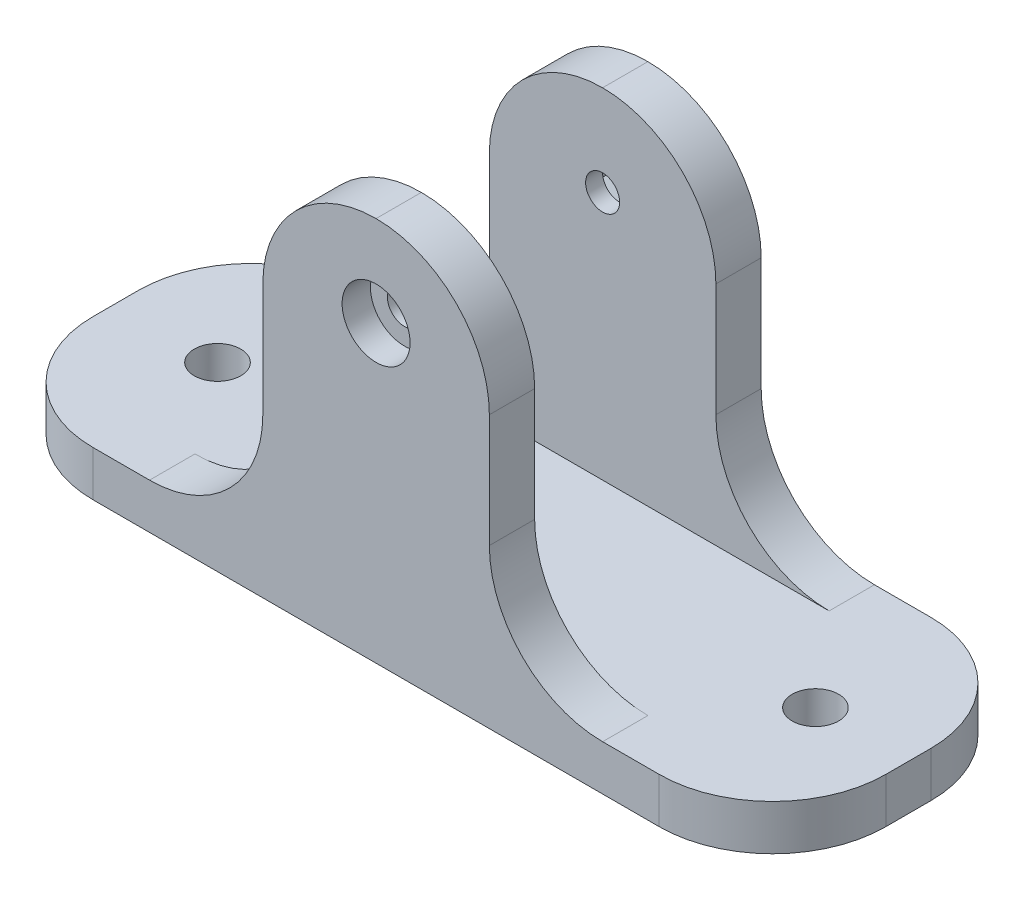
ISO-10303-21;
HEADER;
FILE_DESCRIPTION(('STEP AP214'),'2;1');
FILE_NAME('part.step','',(''),(''),'','','');
FILE_SCHEMA(('AUTOMOTIVE_DESIGN { 1 0 10303 214 1 1 1 1 }'));
ENDSEC;
DATA;
#1=APPLICATION_CONTEXT('core data for automotive mechanical design processes');
#2=APPLICATION_PROTOCOL_DEFINITION('international standard','automotive_design',2000,#1);
#3=PRODUCT_CONTEXT('',#1,'mechanical');
#4=PRODUCT('Part','Part','',(#3));
#5=PRODUCT_RELATED_PRODUCT_CATEGORY('part','',(#4));
#6=PRODUCT_DEFINITION_FORMATION('','',#4);
#7=PRODUCT_DEFINITION_CONTEXT('part definition',#1,'design');
#8=PRODUCT_DEFINITION('design','',#6,#7);
#9=PRODUCT_DEFINITION_SHAPE('','',#8);
#10=(LENGTH_UNIT() NAMED_UNIT(*) SI_UNIT(.MILLI.,.METRE.));
#11=(NAMED_UNIT(*) PLANE_ANGLE_UNIT() SI_UNIT($,.RADIAN.));
#12=(NAMED_UNIT(*) SI_UNIT($,.STERADIAN.) SOLID_ANGLE_UNIT());
#13=UNCERTAINTY_MEASURE_WITH_UNIT(LENGTH_MEASURE(1.E-05),#10,'distance_accuracy_value','');
#14=(GEOMETRIC_REPRESENTATION_CONTEXT(3) GLOBAL_UNCERTAINTY_ASSIGNED_CONTEXT((#13)) GLOBAL_UNIT_ASSIGNED_CONTEXT((#10,
#11,#12)) REPRESENTATION_CONTEXT('',''));
#15=CARTESIAN_POINT('',(0.,0.,0.));
#16=DIRECTION('',(0.,0.,1.));
#17=DIRECTION('',(1.,0.,0.));
#18=AXIS2_PLACEMENT_3D('',#15,#16,#17);
#19=CARTESIAN_POINT('',(0.,24.,-16.2426406871193));
#20=DIRECTION('',(0.,0.,1.));
#21=DIRECTION('',(1.,0.,0.));
#22=AXIS2_PLACEMENT_3D('',#19,#20,#21);
#23=CYLINDRICAL_SURFACE('',#22,1.5);
#24=CARTESIAN_POINT('',(0.,24.,-8.));
#25=DIRECTION('',(0.,0.,-1.));
#26=DIRECTION('',(-1.,0.,0.));
#27=AXIS2_PLACEMENT_3D('',#24,#25,#26);
#28=CIRCLE('',#27,1.5);
#29=CARTESIAN_POINT('',(-1.5,24.,-8.));
#30=VERTEX_POINT('',#29);
#31=EDGE_CURVE('E304',#30,#30,#28,.T.);
#32=ORIENTED_EDGE('',*,*,#31,.F.);
#33=EDGE_LOOP('',(#32));
#34=FACE_BOUND('',#33,.T.);
#35=CARTESIAN_POINT('',(0.,24.,-9.5));
#36=DIRECTION('',(0.,0.,-1.));
#37=DIRECTION('',(-1.,0.,0.));
#38=AXIS2_PLACEMENT_3D('',#35,#36,#37);
#39=CIRCLE('',#38,1.5);
#40=CARTESIAN_POINT('',(-1.5,24.,-9.5));
#41=VERTEX_POINT('',#40);
#42=EDGE_CURVE('E45',#41,#41,#39,.F.);
#43=ORIENTED_EDGE('',*,*,#42,.F.);
#44=EDGE_LOOP('',(#43));
#45=FACE_BOUND('',#44,.T.);
#46=ADVANCED_FACE('F41',(#34,#45),#23,.F.);
#47=CARTESIAN_POINT('',(0.,24.,8.));
#48=DIRECTION('',(0.,0.,1.));
#49=DIRECTION('',(1.,0.,0.));
#50=AXIS2_PLACEMENT_3D('',#47,#48,#49);
#51=CIRCLE('',#50,1.5);
#52=CARTESIAN_POINT('',(1.5,24.,8.));
#53=VERTEX_POINT('',#52);
#54=EDGE_CURVE('E298',#53,#53,#51,.T.);
#55=ORIENTED_EDGE('',*,*,#54,.F.);
#56=EDGE_LOOP('',(#55));
#57=FACE_BOUND('',#56,.T.);
#58=CARTESIAN_POINT('',(0.,24.,9.5));
#59=DIRECTION('',(0.,0.,1.));
#60=DIRECTION('',(1.,0.,0.));
#61=AXIS2_PLACEMENT_3D('',#58,#59,#60);
#62=CIRCLE('',#61,1.5);
#63=CARTESIAN_POINT('',(1.5,24.,9.5));
#64=VERTEX_POINT('',#63);
#65=EDGE_CURVE('E287',#64,#64,#62,.F.);
#66=ORIENTED_EDGE('',*,*,#65,.F.);
#67=EDGE_LOOP('',(#66));
#68=FACE_BOUND('',#67,.T.);
#69=ADVANCED_FACE('F465',(#57,#68),#23,.F.);
#70=CARTESIAN_POINT('',(0.,2.,0.));
#71=DIRECTION('',(0.,-1.,0.));
#72=DIRECTION('',(0.,0.,-1.));
#73=AXIS2_PLACEMENT_3D('',#70,#71,#72);
#74=PLANE('',#73);
#75=CARTESIAN_POINT('',(-26.,2.,0.));
#76=DIRECTION('',(0.,1.,0.));
#77=DIRECTION('',(0.,0.,1.));
#78=AXIS2_PLACEMENT_3D('',#75,#76,#77);
#79=CIRCLE('',#78,2.05);
#80=CARTESIAN_POINT('',(-26.,2.,2.05));
#81=VERTEX_POINT('',#80);
#82=EDGE_CURVE('E291',#81,#81,#79,.T.);
#83=ORIENTED_EDGE('',*,*,#82,.F.);
#84=EDGE_LOOP('',(#83));
#85=FACE_BOUND('',#84,.T.);
#86=CARTESIAN_POINT('',(26.7891565601489,2.,0.));
#87=DIRECTION('',(0.,1.,0.));
#88=DIRECTION('',(0.,0.,1.));
#89=AXIS2_PLACEMENT_3D('',#86,#87,#88);
#90=CIRCLE('',#89,2.05);
#91=CARTESIAN_POINT('',(26.7891565601489,2.,2.05));
#92=VERTEX_POINT('',#91);
#93=EDGE_CURVE('E295',#92,#92,#90,.T.);
#94=ORIENTED_EDGE('',*,*,#93,.F.);
#95=EDGE_LOOP('',(#94));
#96=FACE_BOUND('',#95,.T.);
#97=DIRECTION('',(1.,0.,0.));
#98=VECTOR('',#97,1.);
#99=CARTESIAN_POINT('',(-35.,2.,12.));
#100=LINE('',#99,#98);
#101=CARTESIAN_POINT('',(20.,2.,12.));
#102=VERTEX_POINT('',#101);
#103=CARTESIAN_POINT('',(25.,2.,12.));
#104=VERTEX_POINT('',#103);
#105=EDGE_CURVE('E339',#102,#104,#100,.T.);
#106=ORIENTED_EDGE('',*,*,#105,.T.);
#107=CARTESIAN_POINT('',(25.,2.,2.));
#108=DIRECTION('',(0.,-1.,0.));
#109=DIRECTION('',(0.,0.,-1.));
#110=AXIS2_PLACEMENT_3D('',#107,#108,#109);
#111=CIRCLE('',#110,10.);
#112=CARTESIAN_POINT('',(35.,2.,2.));
#113=VERTEX_POINT('',#112);
#114=EDGE_CURVE('E453',#104,#113,#111,.F.);
#115=ORIENTED_EDGE('',*,*,#114,.T.);
#116=DIRECTION('',(0.,0.,-1.));
#117=VECTOR('',#116,1.);
#118=CARTESIAN_POINT('',(35.,2.,12.));
#119=LINE('',#118,#117);
#120=CARTESIAN_POINT('',(35.,2.,-2.));
#121=VERTEX_POINT('',#120);
#122=EDGE_CURVE('E330',#113,#121,#119,.T.);
#123=ORIENTED_EDGE('',*,*,#122,.T.);
#124=CARTESIAN_POINT('',(25.,2.,-2.));
#125=DIRECTION('',(0.,-1.,0.));
#126=DIRECTION('',(0.,0.,-1.));
#127=AXIS2_PLACEMENT_3D('',#124,#125,#126);
#128=CIRCLE('',#127,10.);
#129=CARTESIAN_POINT('',(25.,2.,-12.));
#130=VERTEX_POINT('',#129);
#131=EDGE_CURVE('E66',#121,#130,#128,.F.);
#132=ORIENTED_EDGE('',*,*,#131,.T.);
#133=DIRECTION('',(-1.,0.,0.));
#134=VECTOR('',#133,1.);
#135=CARTESIAN_POINT('',(-35.,2.,-12.));
#136=LINE('',#135,#134);
#137=CARTESIAN_POINT('',(20.,2.,-12.));
#138=VERTEX_POINT('',#137);
#139=EDGE_CURVE('E334',#130,#138,#136,.T.);
#140=ORIENTED_EDGE('',*,*,#139,.T.);
#141=DIRECTION('',(0.,0.,-1.));
#142=VECTOR('',#141,1.);
#143=CARTESIAN_POINT('',(20.,2.,-8.));
#144=LINE('',#143,#142);
#145=CARTESIAN_POINT('',(20.,2.,-8.));
#146=VERTEX_POINT('',#145);
#147=EDGE_CURVE('E357',#138,#146,#144,.F.);
#148=ORIENTED_EDGE('',*,*,#147,.T.);
#149=DIRECTION('',(1.,0.,0.));
#150=VECTOR('',#149,1.);
#151=CARTESIAN_POINT('',(-10.,2.,-8.));
#152=LINE('',#151,#150);
#153=CARTESIAN_POINT('',(-20.,2.,-8.));
#154=VERTEX_POINT('',#153);
#155=EDGE_CURVE('E319',#154,#146,#152,.T.);
#156=ORIENTED_EDGE('',*,*,#155,.F.);
#157=DIRECTION('',(0.,0.,1.));
#158=VECTOR('',#157,1.);
#159=CARTESIAN_POINT('',(-20.,2.,-12.));
#160=LINE('',#159,#158);
#161=CARTESIAN_POINT('',(-20.,2.,-12.));
#162=VERTEX_POINT('',#161);
#163=EDGE_CURVE('E363',#154,#162,#160,.F.);
#164=ORIENTED_EDGE('',*,*,#163,.T.);
#165=CARTESIAN_POINT('',(-25.,2.,-12.));
#166=VERTEX_POINT('',#165);
#167=EDGE_CURVE('E332',#162,#166,#136,.T.);
#168=ORIENTED_EDGE('',*,*,#167,.T.);
#169=CARTESIAN_POINT('',(-25.,2.,-2.));
#170=DIRECTION('',(0.,-1.,0.));
#171=DIRECTION('',(0.,0.,-1.));
#172=AXIS2_PLACEMENT_3D('',#169,#170,#171);
#173=CIRCLE('',#172,10.);
#174=CARTESIAN_POINT('',(-35.,2.,-2.));
#175=VERTEX_POINT('',#174);
#176=EDGE_CURVE('E450',#166,#175,#173,.F.);
#177=ORIENTED_EDGE('',*,*,#176,.T.);
#178=DIRECTION('',(0.,0.,1.));
#179=VECTOR('',#178,1.);
#180=CARTESIAN_POINT('',(-35.,2.,12.));
#181=LINE('',#180,#179);
#182=CARTESIAN_POINT('',(-35.,2.,2.));
#183=VERTEX_POINT('',#182);
#184=EDGE_CURVE('E336',#175,#183,#181,.T.);
#185=ORIENTED_EDGE('',*,*,#184,.T.);
#186=CARTESIAN_POINT('',(-25.,2.,2.));
#187=DIRECTION('',(0.,-1.,0.));
#188=DIRECTION('',(0.,0.,-1.));
#189=AXIS2_PLACEMENT_3D('',#186,#187,#188);
#190=CIRCLE('',#189,10.);
#191=CARTESIAN_POINT('',(-25.,2.,12.));
#192=VERTEX_POINT('',#191);
#193=EDGE_CURVE('E448',#183,#192,#190,.F.);
#194=ORIENTED_EDGE('',*,*,#193,.T.);
#195=CARTESIAN_POINT('',(-20.,2.,12.));
#196=VERTEX_POINT('',#195);
#197=EDGE_CURVE('E340',#192,#196,#100,.T.);
#198=ORIENTED_EDGE('',*,*,#197,.T.);
#199=DIRECTION('',(0.,0.,1.));
#200=VECTOR('',#199,1.);
#201=CARTESIAN_POINT('',(-20.,2.,8.));
#202=LINE('',#201,#200);
#203=CARTESIAN_POINT('',(-20.,2.,8.));
#204=VERTEX_POINT('',#203);
#205=EDGE_CURVE('E360',#196,#204,#202,.F.);
#206=ORIENTED_EDGE('',*,*,#205,.T.);
#207=DIRECTION('',(-1.,0.,0.));
#208=VECTOR('',#207,1.);
#209=CARTESIAN_POINT('',(-10.,2.,8.));
#210=LINE('',#209,#208);
#211=CARTESIAN_POINT('',(20.,2.,8.));
#212=VERTEX_POINT('',#211);
#213=EDGE_CURVE('E317',#212,#204,#210,.T.);
#214=ORIENTED_EDGE('',*,*,#213,.F.);
#215=DIRECTION('',(0.,0.,-1.));
#216=VECTOR('',#215,1.);
#217=CARTESIAN_POINT('',(20.,2.,12.));
#218=LINE('',#217,#216);
#219=EDGE_CURVE('E355',#212,#102,#218,.F.);
#220=ORIENTED_EDGE('',*,*,#219,.T.);
#221=EDGE_LOOP('',(#106,#115,#123,#132,#140,#148,#156,#164,#168,#177,#185,#194,#198,#206,#214,#220));
#222=FACE_BOUND('',#221,.T.);
#223=ADVANCED_FACE('F467',(#85,#96,#222),#74,.F.);
#224=CARTESIAN_POINT('',(35.,2.,12.));
#225=DIRECTION('',(-1.,0.,0.));
#226=DIRECTION('',(0.,0.,1.));
#227=AXIS2_PLACEMENT_3D('',#224,#225,#226);
#228=PLANE('',#227);
#229=ORIENTED_EDGE('',*,*,#122,.F.);
#230=DIRECTION('',(0.,-1.,0.));
#231=VECTOR('',#230,1.);
#232=CARTESIAN_POINT('',(35.,2.,2.));
#233=LINE('',#232,#231);
#234=CARTESIAN_POINT('',(35.,-2.,2.));
#235=VERTEX_POINT('',#234);
#236=EDGE_CURVE('E432',#113,#235,#233,.T.);
#237=ORIENTED_EDGE('',*,*,#236,.T.);
#238=DIRECTION('',(0.,0.,-1.));
#239=VECTOR('',#238,1.);
#240=CARTESIAN_POINT('',(35.,-2.,12.));
#241=LINE('',#240,#239);
#242=CARTESIAN_POINT('',(35.,-2.,-2.));
#243=VERTEX_POINT('',#242);
#244=EDGE_CURVE('E329',#235,#243,#241,.T.);
#245=ORIENTED_EDGE('',*,*,#244,.T.);
#246=DIRECTION('',(0.,-1.,0.));
#247=VECTOR('',#246,1.);
#248=CARTESIAN_POINT('',(35.,2.,-2.));
#249=LINE('',#248,#247);
#250=EDGE_CURVE('E424',#243,#121,#249,.F.);
#251=ORIENTED_EDGE('',*,*,#250,.T.);
#252=EDGE_LOOP('',(#229,#237,#245,#251));
#253=FACE_BOUND('',#252,.T.);
#254=ADVANCED_FACE('F474',(#253),#228,.F.);
#255=CARTESIAN_POINT('',(-35.,2.,-12.));
#256=DIRECTION('',(0.,0.,1.));
#257=DIRECTION('',(1.,0.,0.));
#258=AXIS2_PLACEMENT_3D('',#255,#256,#257);
#259=PLANE('',#258);
#260=DIRECTION('',(0.866025403784438,0.500000000000001,0.));
#261=VECTOR('',#260,1.);
#262=CARTESIAN_POINT('',(-2.75,25.5877132402715,-12.));
#263=LINE('',#262,#261);
#264=CARTESIAN_POINT('',(-2.75,25.5877132402715,-12.));
#265=VERTEX_POINT('',#264);
#266=CARTESIAN_POINT('',(0.,27.1754264805429,-12.));
#267=VERTEX_POINT('',#266);
#268=EDGE_CURVE('E265',#265,#267,#263,.T.);
#269=ORIENTED_EDGE('',*,*,#268,.F.);
#270=DIRECTION('',(0.,1.,0.));
#271=VECTOR('',#270,1.);
#272=CARTESIAN_POINT('',(-2.75,22.4122867597285,-12.));
#273=LINE('',#272,#271);
#274=CARTESIAN_POINT('',(-2.75,22.4122867597285,-12.));
#275=VERTEX_POINT('',#274);
#276=EDGE_CURVE('E58',#275,#265,#273,.T.);
#277=ORIENTED_EDGE('',*,*,#276,.F.);
#278=DIRECTION('',(-0.866025403784438,0.500000000000001,0.));
#279=VECTOR('',#278,1.);
#280=CARTESIAN_POINT('',(0.,20.8245735194571,-12.));
#281=LINE('',#280,#279);
#282=CARTESIAN_POINT('',(0.,20.8245735194571,-12.));
#283=VERTEX_POINT('',#282);
#284=EDGE_CURVE('E251',#283,#275,#281,.T.);
#285=ORIENTED_EDGE('',*,*,#284,.F.);
#286=DIRECTION('',(-0.866025403784439,-0.5,0.));
#287=VECTOR('',#286,1.);
#288=CARTESIAN_POINT('',(2.75,22.4122867597285,-12.));
#289=LINE('',#288,#287);
#290=CARTESIAN_POINT('',(2.75,22.4122867597285,-12.));
#291=VERTEX_POINT('',#290);
#292=EDGE_CURVE('E254',#291,#283,#289,.T.);
#293=ORIENTED_EDGE('',*,*,#292,.F.);
#294=DIRECTION('',(0.,-1.,0.));
#295=VECTOR('',#294,1.);
#296=CARTESIAN_POINT('',(2.75,25.5877132402715,-12.));
#297=LINE('',#296,#295);
#298=CARTESIAN_POINT('',(2.75,25.5877132402715,-12.));
#299=VERTEX_POINT('',#298);
#300=EDGE_CURVE('E270',#299,#291,#297,.T.);
#301=ORIENTED_EDGE('',*,*,#300,.F.);
#302=DIRECTION('',(0.866025403784438,-0.5,0.));
#303=VECTOR('',#302,1.);
#304=CARTESIAN_POINT('',(0.,27.1754264805429,-12.));
#305=LINE('',#304,#303);
#306=EDGE_CURVE('E267',#267,#299,#305,.T.);
#307=ORIENTED_EDGE('',*,*,#306,.F.);
#308=EDGE_LOOP('',(#269,#277,#285,#293,#301,#307));
#309=FACE_BOUND('',#308,.T.);
#310=ORIENTED_EDGE('',*,*,#139,.F.);
#311=DIRECTION('',(0.,-1.,0.));
#312=VECTOR('',#311,1.);
#313=CARTESIAN_POINT('',(25.,2.,-12.));
#314=LINE('',#313,#312);
#315=CARTESIAN_POINT('',(25.,-2.,-12.));
#316=VERTEX_POINT('',#315);
#317=EDGE_CURVE('E457',#130,#316,#314,.T.);
#318=ORIENTED_EDGE('',*,*,#317,.T.);
#319=DIRECTION('',(-1.,0.,0.));
#320=VECTOR('',#319,1.);
#321=CARTESIAN_POINT('',(-35.,-2.,-12.));
#322=LINE('',#321,#320);
#323=CARTESIAN_POINT('',(-25.,-2.,-12.));
#324=VERTEX_POINT('',#323);
#325=EDGE_CURVE('E345',#316,#324,#322,.T.);
#326=ORIENTED_EDGE('',*,*,#325,.T.);
#327=DIRECTION('',(0.,-1.,0.));
#328=VECTOR('',#327,1.);
#329=CARTESIAN_POINT('',(-25.,2.,-12.));
#330=LINE('',#329,#328);
#331=EDGE_CURVE('E455',#324,#166,#330,.F.);
#332=ORIENTED_EDGE('',*,*,#331,.T.);
#333=ORIENTED_EDGE('',*,*,#167,.F.);
#334=CARTESIAN_POINT('',(-20.,12.,-12.));
#335=DIRECTION('',(0.,0.,1.));
#336=DIRECTION('',(1.,0.,0.));
#337=AXIS2_PLACEMENT_3D('',#334,#335,#336);
#338=CIRCLE('',#337,10.);
#339=CARTESIAN_POINT('',(-10.,12.,-12.));
#340=VERTEX_POINT('',#339);
#341=EDGE_CURVE('E377',#162,#340,#338,.T.);
#342=ORIENTED_EDGE('',*,*,#341,.T.);
#343=DIRECTION('',(0.,-1.,0.));
#344=VECTOR('',#343,1.);
#345=CARTESIAN_POINT('',(-10.,32.,-12.));
#346=LINE('',#345,#344);
#347=CARTESIAN_POINT('',(-10.,22.,-12.));
#348=VERTEX_POINT('',#347);
#349=EDGE_CURVE('E321',#348,#340,#346,.T.);
#350=ORIENTED_EDGE('',*,*,#349,.F.);
#351=CARTESIAN_POINT('',(0.,22.,-12.));
#352=DIRECTION('',(0.,0.,1.));
#353=DIRECTION('',(1.,0.,0.));
#354=AXIS2_PLACEMENT_3D('',#351,#352,#353);
#355=CIRCLE('',#354,10.);
#356=CARTESIAN_POINT('',(0.,32.,-12.));
#357=VERTEX_POINT('',#356);
#358=EDGE_CURVE('E411',#348,#357,#355,.F.);
#359=ORIENTED_EDGE('',*,*,#358,.T.);
#360=CARTESIAN_POINT('',(0.,22.,-12.));
#361=DIRECTION('',(0.,0.,1.));
#362=DIRECTION('',(1.,0.,0.));
#363=AXIS2_PLACEMENT_3D('',#360,#361,#362);
#364=CIRCLE('',#363,10.);
#365=CARTESIAN_POINT('',(10.,22.,-12.));
#366=VERTEX_POINT('',#365);
#367=EDGE_CURVE('E413',#357,#366,#364,.F.);
#368=ORIENTED_EDGE('',*,*,#367,.T.);
#369=DIRECTION('',(0.,-1.,0.));
#370=VECTOR('',#369,1.);
#371=CARTESIAN_POINT('',(10.,32.,-12.));
#372=LINE('',#371,#370);
#373=CARTESIAN_POINT('',(10.,12.,-12.));
#374=VERTEX_POINT('',#373);
#375=EDGE_CURVE('E323',#366,#374,#372,.T.);
#376=ORIENTED_EDGE('',*,*,#375,.T.);
#377=CARTESIAN_POINT('',(20.,12.,-12.));
#378=DIRECTION('',(0.,0.,1.));
#379=DIRECTION('',(1.,0.,0.));
#380=AXIS2_PLACEMENT_3D('',#377,#378,#379);
#381=CIRCLE('',#380,10.);
#382=EDGE_CURVE('E386',#374,#138,#381,.T.);
#383=ORIENTED_EDGE('',*,*,#382,.T.);
#384=EDGE_LOOP('',(#310,#318,#326,#332,#333,#342,#350,#359,#368,#376,#383));
#385=FACE_BOUND('',#384,.T.);
#386=ADVANCED_FACE('F519',(#309,#385),#259,.F.);
#387=CARTESIAN_POINT('',(-35.,2.,12.));
#388=DIRECTION('',(1.,0.,0.));
#389=DIRECTION('',(0.,0.,-1.));
#390=AXIS2_PLACEMENT_3D('',#387,#388,#389);
#391=PLANE('',#390);
#392=ORIENTED_EDGE('',*,*,#184,.F.);
#393=DIRECTION('',(0.,-1.,0.));
#394=VECTOR('',#393,1.);
#395=CARTESIAN_POINT('',(-35.,2.,-2.));
#396=LINE('',#395,#394);
#397=CARTESIAN_POINT('',(-35.,-2.,-2.));
#398=VERTEX_POINT('',#397);
#399=EDGE_CURVE('E11',#175,#398,#396,.T.);
#400=ORIENTED_EDGE('',*,*,#399,.T.);
#401=DIRECTION('',(0.,0.,1.));
#402=VECTOR('',#401,1.);
#403=CARTESIAN_POINT('',(-35.,-2.,12.));
#404=LINE('',#403,#402);
#405=CARTESIAN_POINT('',(-35.,-2.,2.));
#406=VERTEX_POINT('',#405);
#407=EDGE_CURVE('E348',#398,#406,#404,.T.);
#408=ORIENTED_EDGE('',*,*,#407,.T.);
#409=DIRECTION('',(0.,-1.,0.));
#410=VECTOR('',#409,1.);
#411=CARTESIAN_POINT('',(-35.,2.,2.));
#412=LINE('',#411,#410);
#413=EDGE_CURVE('E50',#406,#183,#412,.F.);
#414=ORIENTED_EDGE('',*,*,#413,.T.);
#415=EDGE_LOOP('',(#392,#400,#408,#414));
#416=FACE_BOUND('',#415,.T.);
#417=ADVANCED_FACE('F515',(#416),#391,.F.);
#418=CARTESIAN_POINT('',(-35.,2.,12.));
#419=DIRECTION('',(0.,0.,-1.));
#420=DIRECTION('',(-1.,0.,0.));
#421=AXIS2_PLACEMENT_3D('',#418,#419,#420);
#422=PLANE('',#421);
#423=CARTESIAN_POINT('',(0.,24.,12.));
#424=DIRECTION('',(0.,0.,1.));
#425=DIRECTION('',(1.,0.,0.));
#426=AXIS2_PLACEMENT_3D('',#423,#424,#425);
#427=CIRCLE('',#426,3.);
#428=CARTESIAN_POINT('',(3.,24.,12.));
#429=VERTEX_POINT('',#428);
#430=EDGE_CURVE('E288',#429,#429,#427,.T.);
#431=ORIENTED_EDGE('',*,*,#430,.F.);
#432=EDGE_LOOP('',(#431));
#433=FACE_BOUND('',#432,.T.);
#434=DIRECTION('',(1.,0.,0.));
#435=VECTOR('',#434,1.);
#436=CARTESIAN_POINT('',(-35.,-2.,12.));
#437=LINE('',#436,#435);
#438=CARTESIAN_POINT('',(-25.,-2.,12.));
#439=VERTEX_POINT('',#438);
#440=CARTESIAN_POINT('',(25.,-2.,12.));
#441=VERTEX_POINT('',#440);
#442=EDGE_CURVE('E333',#439,#441,#437,.T.);
#443=ORIENTED_EDGE('',*,*,#442,.T.);
#444=DIRECTION('',(0.,-1.,0.));
#445=VECTOR('',#444,1.);
#446=CARTESIAN_POINT('',(25.,2.,12.));
#447=LINE('',#446,#445);
#448=EDGE_CURVE('E446',#441,#104,#447,.F.);
#449=ORIENTED_EDGE('',*,*,#448,.T.);
#450=ORIENTED_EDGE('',*,*,#105,.F.);
#451=CARTESIAN_POINT('',(20.,12.,12.));
#452=DIRECTION('',(0.,0.,-1.));
#453=DIRECTION('',(-1.,0.,0.));
#454=AXIS2_PLACEMENT_3D('',#451,#452,#453);
#455=CIRCLE('',#454,10.);
#456=CARTESIAN_POINT('',(10.,12.,12.));
#457=VERTEX_POINT('',#456);
#458=EDGE_CURVE('E395',#102,#457,#455,.T.);
#459=ORIENTED_EDGE('',*,*,#458,.T.);
#460=DIRECTION('',(0.,-1.,0.));
#461=VECTOR('',#460,1.);
#462=CARTESIAN_POINT('',(10.,32.,12.));
#463=LINE('',#462,#461);
#464=CARTESIAN_POINT('',(10.,22.,12.));
#465=VERTEX_POINT('',#464);
#466=EDGE_CURVE('E310',#465,#457,#463,.T.);
#467=ORIENTED_EDGE('',*,*,#466,.F.);
#468=CARTESIAN_POINT('',(0.,22.,12.));
#469=DIRECTION('',(0.,0.,-1.));
#470=DIRECTION('',(-1.,0.,0.));
#471=AXIS2_PLACEMENT_3D('',#468,#469,#470);
#472=CIRCLE('',#471,10.);
#473=CARTESIAN_POINT('',(0.,32.,12.));
#474=VERTEX_POINT('',#473);
#475=EDGE_CURVE('E398',#465,#474,#472,.F.);
#476=ORIENTED_EDGE('',*,*,#475,.T.);
#477=CARTESIAN_POINT('',(0.,22.,12.));
#478=DIRECTION('',(0.,0.,-1.));
#479=DIRECTION('',(-1.,0.,0.));
#480=AXIS2_PLACEMENT_3D('',#477,#478,#479);
#481=CIRCLE('',#480,10.);
#482=CARTESIAN_POINT('',(-10.,22.,12.));
#483=VERTEX_POINT('',#482);
#484=EDGE_CURVE('E400',#474,#483,#481,.F.);
#485=ORIENTED_EDGE('',*,*,#484,.T.);
#486=DIRECTION('',(0.,-1.,0.));
#487=VECTOR('',#486,1.);
#488=CARTESIAN_POINT('',(-10.,32.,12.));
#489=LINE('',#488,#487);
#490=CARTESIAN_POINT('',(-10.,12.,12.));
#491=VERTEX_POINT('',#490);
#492=EDGE_CURVE('E308',#483,#491,#489,.T.);
#493=ORIENTED_EDGE('',*,*,#492,.T.);
#494=CARTESIAN_POINT('',(-20.,12.,12.));
#495=DIRECTION('',(0.,0.,-1.));
#496=DIRECTION('',(-1.,0.,0.));
#497=AXIS2_PLACEMENT_3D('',#494,#495,#496);
#498=CIRCLE('',#497,10.);
#499=EDGE_CURVE('E380',#491,#196,#498,.T.);
#500=ORIENTED_EDGE('',*,*,#499,.T.);
#501=ORIENTED_EDGE('',*,*,#197,.F.);
#502=DIRECTION('',(0.,-1.,0.));
#503=VECTOR('',#502,1.);
#504=CARTESIAN_POINT('',(-25.,2.,12.));
#505=LINE('',#504,#503);
#506=EDGE_CURVE('E443',#192,#439,#505,.T.);
#507=ORIENTED_EDGE('',*,*,#506,.T.);
#508=EDGE_LOOP('',(#443,#449,#450,#459,#467,#476,#485,#493,#500,#501,#507));
#509=FACE_BOUND('',#508,.T.);
#510=ADVANCED_FACE('F511',(#433,#509),#422,.F.);
#511=CARTESIAN_POINT('',(0.,-2.,0.));
#512=DIRECTION('',(0.,-1.,0.));
#513=DIRECTION('',(0.,0.,-1.));
#514=AXIS2_PLACEMENT_3D('',#511,#512,#513);
#515=PLANE('',#514);
#516=CARTESIAN_POINT('',(-26.,-2.,0.));
#517=DIRECTION('',(0.,-1.,0.));
#518=DIRECTION('',(0.,0.,-1.));
#519=AXIS2_PLACEMENT_3D('',#516,#517,#518);
#520=CIRCLE('',#519,2.05);
#521=CARTESIAN_POINT('',(-26.,-2.,-2.05));
#522=VERTEX_POINT('',#521);
#523=EDGE_CURVE('E294',#522,#522,#520,.F.);
#524=ORIENTED_EDGE('',*,*,#523,.T.);
#525=EDGE_LOOP('',(#524));
#526=FACE_BOUND('',#525,.T.);
#527=CARTESIAN_POINT('',(26.7891565601489,-2.,0.));
#528=DIRECTION('',(0.,-1.,0.));
#529=DIRECTION('',(0.,0.,-1.));
#530=AXIS2_PLACEMENT_3D('',#527,#528,#529);
#531=CIRCLE('',#530,2.05);
#532=CARTESIAN_POINT('',(26.7891565601489,-2.,-2.05));
#533=VERTEX_POINT('',#532);
#534=EDGE_CURVE('E299',#533,#533,#531,.F.);
#535=ORIENTED_EDGE('',*,*,#534,.T.);
#536=EDGE_LOOP('',(#535));
#537=FACE_BOUND('',#536,.T.);
#538=ORIENTED_EDGE('',*,*,#244,.F.);
#539=CARTESIAN_POINT('',(25.,-2.,2.));
#540=DIRECTION('',(0.,-1.,0.));
#541=DIRECTION('',(0.,0.,-1.));
#542=AXIS2_PLACEMENT_3D('',#539,#540,#541);
#543=CIRCLE('',#542,10.);
#544=EDGE_CURVE('E441',#235,#441,#543,.T.);
#545=ORIENTED_EDGE('',*,*,#544,.T.);
#546=ORIENTED_EDGE('',*,*,#442,.F.);
#547=CARTESIAN_POINT('',(-25.,-2.,2.));
#548=DIRECTION('',(0.,-1.,0.));
#549=DIRECTION('',(0.,0.,-1.));
#550=AXIS2_PLACEMENT_3D('',#547,#548,#549);
#551=CIRCLE('',#550,10.);
#552=EDGE_CURVE('E435',#439,#406,#551,.T.);
#553=ORIENTED_EDGE('',*,*,#552,.T.);
#554=ORIENTED_EDGE('',*,*,#407,.F.);
#555=CARTESIAN_POINT('',(-25.,-2.,-2.));
#556=DIRECTION('',(0.,-1.,0.));
#557=DIRECTION('',(0.,0.,-1.));
#558=AXIS2_PLACEMENT_3D('',#555,#556,#557);
#559=CIRCLE('',#558,10.);
#560=EDGE_CURVE('E437',#398,#324,#559,.T.);
#561=ORIENTED_EDGE('',*,*,#560,.T.);
#562=ORIENTED_EDGE('',*,*,#325,.F.);
#563=CARTESIAN_POINT('',(25.,-2.,-2.));
#564=DIRECTION('',(0.,-1.,0.));
#565=DIRECTION('',(0.,0.,-1.));
#566=AXIS2_PLACEMENT_3D('',#563,#564,#565);
#567=CIRCLE('',#566,10.);
#568=EDGE_CURVE('E439',#316,#243,#567,.T.);
#569=ORIENTED_EDGE('',*,*,#568,.T.);
#570=EDGE_LOOP('',(#538,#545,#546,#553,#554,#561,#562,#569));
#571=FACE_BOUND('',#570,.T.);
#572=ADVANCED_FACE('F506',(#526,#537,#571),#515,.T.);
#573=CARTESIAN_POINT('',(-10.,32.,-12.));
#574=DIRECTION('',(1.,0.,0.));
#575=DIRECTION('',(0.,0.,-1.));
#576=AXIS2_PLACEMENT_3D('',#573,#574,#575);
#577=PLANE('',#576);
#578=DIRECTION('',(0.,-1.,0.));
#579=VECTOR('',#578,1.);
#580=CARTESIAN_POINT('',(-10.,32.,-8.));
#581=LINE('',#580,#579);
#582=CARTESIAN_POINT('',(-10.,22.,-8.));
#583=VERTEX_POINT('',#582);
#584=CARTESIAN_POINT('',(-10.,12.,-8.));
#585=VERTEX_POINT('',#584);
#586=EDGE_CURVE('E327',#583,#585,#581,.T.);
#587=ORIENTED_EDGE('',*,*,#586,.F.);
#588=DIRECTION('',(0.,0.,1.));
#589=VECTOR('',#588,1.);
#590=CARTESIAN_POINT('',(-10.,22.,-12.));
#591=LINE('',#590,#589);
#592=EDGE_CURVE('E422',#583,#348,#591,.F.);
#593=ORIENTED_EDGE('',*,*,#592,.T.);
#594=ORIENTED_EDGE('',*,*,#349,.T.);
#595=DIRECTION('',(0.,0.,1.));
#596=VECTOR('',#595,1.);
#597=CARTESIAN_POINT('',(-10.,12.,-8.));
#598=LINE('',#597,#596);
#599=EDGE_CURVE('E342',#340,#585,#598,.T.);
#600=ORIENTED_EDGE('',*,*,#599,.T.);
#601=EDGE_LOOP('',(#587,#593,#594,#600));
#602=FACE_BOUND('',#601,.T.);
#603=ADVANCED_FACE('F503',(#602),#577,.F.);
#604=CARTESIAN_POINT('',(-10.,32.,-8.));
#605=DIRECTION('',(0.,0.,-1.));
#606=DIRECTION('',(-1.,0.,0.));
#607=AXIS2_PLACEMENT_3D('',#604,#605,#606);
#608=PLANE('',#607);
#609=ORIENTED_EDGE('',*,*,#31,.T.);
#610=EDGE_LOOP('',(#609));
#611=FACE_BOUND('',#610,.T.);
#612=DIRECTION('',(0.,-1.,0.));
#613=VECTOR('',#612,1.);
#614=CARTESIAN_POINT('',(10.,32.,-8.));
#615=LINE('',#614,#613);
#616=CARTESIAN_POINT('',(10.,22.,-8.));
#617=VERTEX_POINT('',#616);
#618=CARTESIAN_POINT('',(10.,12.,-8.));
#619=VERTEX_POINT('',#618);
#620=EDGE_CURVE('E325',#617,#619,#615,.T.);
#621=ORIENTED_EDGE('',*,*,#620,.F.);
#622=CARTESIAN_POINT('',(0.,22.,-8.));
#623=DIRECTION('',(0.,0.,-1.));
#624=DIRECTION('',(-1.,0.,0.));
#625=AXIS2_PLACEMENT_3D('',#622,#623,#624);
#626=CIRCLE('',#625,10.);
#627=CARTESIAN_POINT('',(0.,32.,-8.));
#628=VERTEX_POINT('',#627);
#629=EDGE_CURVE('E420',#617,#628,#626,.F.);
#630=ORIENTED_EDGE('',*,*,#629,.T.);
#631=CARTESIAN_POINT('',(0.,22.,-8.));
#632=DIRECTION('',(0.,0.,-1.));
#633=DIRECTION('',(-1.,0.,0.));
#634=AXIS2_PLACEMENT_3D('',#631,#632,#633);
#635=CIRCLE('',#634,10.);
#636=EDGE_CURVE('E418',#628,#583,#635,.F.);
#637=ORIENTED_EDGE('',*,*,#636,.T.);
#638=ORIENTED_EDGE('',*,*,#586,.T.);
#639=CARTESIAN_POINT('',(-20.,12.,-8.));
#640=DIRECTION('',(0.,0.,-1.));
#641=DIRECTION('',(-1.,0.,0.));
#642=AXIS2_PLACEMENT_3D('',#639,#640,#641);
#643=CIRCLE('',#642,10.);
#644=EDGE_CURVE('E374',#585,#154,#643,.T.);
#645=ORIENTED_EDGE('',*,*,#644,.T.);
#646=ORIENTED_EDGE('',*,*,#155,.T.);
#647=CARTESIAN_POINT('',(20.,12.,-8.));
#648=DIRECTION('',(0.,0.,-1.));
#649=DIRECTION('',(-1.,0.,0.));
#650=AXIS2_PLACEMENT_3D('',#647,#648,#649);
#651=CIRCLE('',#650,10.);
#652=EDGE_CURVE('E389',#146,#619,#651,.T.);
#653=ORIENTED_EDGE('',*,*,#652,.T.);
#654=EDGE_LOOP('',(#621,#630,#637,#638,#645,#646,#653));
#655=FACE_BOUND('',#654,.T.);
#656=ADVANCED_FACE('F499',(#611,#655),#608,.F.);
#657=CARTESIAN_POINT('',(10.,32.,-12.));
#658=DIRECTION('',(-1.,0.,0.));
#659=DIRECTION('',(0.,0.,1.));
#660=AXIS2_PLACEMENT_3D('',#657,#658,#659);
#661=PLANE('',#660);
#662=ORIENTED_EDGE('',*,*,#375,.F.);
#663=DIRECTION('',(0.,0.,-1.));
#664=VECTOR('',#663,1.);
#665=CARTESIAN_POINT('',(10.,22.,-8.));
#666=LINE('',#665,#664);
#667=EDGE_CURVE('E415',#366,#617,#666,.F.);
#668=ORIENTED_EDGE('',*,*,#667,.T.);
#669=ORIENTED_EDGE('',*,*,#620,.T.);
#670=DIRECTION('',(0.,0.,-1.));
#671=VECTOR('',#670,1.);
#672=CARTESIAN_POINT('',(10.,12.,-12.));
#673=LINE('',#672,#671);
#674=EDGE_CURVE('E368',#619,#374,#673,.T.);
#675=ORIENTED_EDGE('',*,*,#674,.T.);
#676=EDGE_LOOP('',(#662,#668,#669,#675));
#677=FACE_BOUND('',#676,.T.);
#678=ADVANCED_FACE('F487',(#677),#661,.F.);
#679=CARTESIAN_POINT('',(-10.,32.,12.));
#680=DIRECTION('',(1.,0.,0.));
#681=DIRECTION('',(0.,0.,-1.));
#682=AXIS2_PLACEMENT_3D('',#679,#680,#681);
#683=PLANE('',#682);
#684=ORIENTED_EDGE('',*,*,#492,.F.);
#685=DIRECTION('',(0.,0.,1.));
#686=VECTOR('',#685,1.);
#687=CARTESIAN_POINT('',(-10.,22.,12.));
#688=LINE('',#687,#686);
#689=CARTESIAN_POINT('',(-10.,22.,8.));
#690=VERTEX_POINT('',#689);
#691=EDGE_CURVE('E402',#483,#690,#688,.F.);
#692=ORIENTED_EDGE('',*,*,#691,.T.);
#693=DIRECTION('',(0.,-1.,0.));
#694=VECTOR('',#693,1.);
#695=CARTESIAN_POINT('',(-10.,32.,8.));
#696=LINE('',#695,#694);
#697=CARTESIAN_POINT('',(-10.,12.,8.));
#698=VERTEX_POINT('',#697);
#699=EDGE_CURVE('E315',#690,#698,#696,.T.);
#700=ORIENTED_EDGE('',*,*,#699,.T.);
#701=DIRECTION('',(0.,0.,1.));
#702=VECTOR('',#701,1.);
#703=CARTESIAN_POINT('',(-10.,12.,12.));
#704=LINE('',#703,#702);
#705=EDGE_CURVE('E365',#698,#491,#704,.T.);
#706=ORIENTED_EDGE('',*,*,#705,.T.);
#707=EDGE_LOOP('',(#684,#692,#700,#706));
#708=FACE_BOUND('',#707,.T.);
#709=ADVANCED_FACE('F483',(#708),#683,.F.);
#710=CARTESIAN_POINT('',(10.,32.,12.));
#711=DIRECTION('',(-1.,0.,0.));
#712=DIRECTION('',(0.,0.,1.));
#713=AXIS2_PLACEMENT_3D('',#710,#711,#712);
#714=PLANE('',#713);
#715=DIRECTION('',(0.,-1.,0.));
#716=VECTOR('',#715,1.);
#717=CARTESIAN_POINT('',(10.,32.,8.));
#718=LINE('',#717,#716);
#719=CARTESIAN_POINT('',(10.,22.,8.));
#720=VERTEX_POINT('',#719);
#721=CARTESIAN_POINT('',(10.,12.,8.));
#722=VERTEX_POINT('',#721);
#723=EDGE_CURVE('E313',#720,#722,#718,.T.);
#724=ORIENTED_EDGE('',*,*,#723,.F.);
#725=DIRECTION('',(0.,0.,-1.));
#726=VECTOR('',#725,1.);
#727=CARTESIAN_POINT('',(10.,22.,12.));
#728=LINE('',#727,#726);
#729=EDGE_CURVE('E409',#720,#465,#728,.F.);
#730=ORIENTED_EDGE('',*,*,#729,.T.);
#731=ORIENTED_EDGE('',*,*,#466,.T.);
#732=DIRECTION('',(0.,0.,-1.));
#733=VECTOR('',#732,1.);
#734=CARTESIAN_POINT('',(10.,12.,8.));
#735=LINE('',#734,#733);
#736=EDGE_CURVE('E371',#457,#722,#735,.T.);
#737=ORIENTED_EDGE('',*,*,#736,.T.);
#738=EDGE_LOOP('',(#724,#730,#731,#737));
#739=FACE_BOUND('',#738,.T.);
#740=ADVANCED_FACE('F486',(#739),#714,.F.);
#741=CARTESIAN_POINT('',(-10.,32.,8.));
#742=DIRECTION('',(0.,0.,1.));
#743=DIRECTION('',(1.,0.,0.));
#744=AXIS2_PLACEMENT_3D('',#741,#742,#743);
#745=PLANE('',#744);
#746=ORIENTED_EDGE('',*,*,#54,.T.);
#747=EDGE_LOOP('',(#746));
#748=FACE_BOUND('',#747,.T.);
#749=ORIENTED_EDGE('',*,*,#699,.F.);
#750=CARTESIAN_POINT('',(0.,22.,8.));
#751=DIRECTION('',(0.,0.,1.));
#752=DIRECTION('',(1.,0.,0.));
#753=AXIS2_PLACEMENT_3D('',#750,#751,#752);
#754=CIRCLE('',#753,10.);
#755=CARTESIAN_POINT('',(0.,32.,8.));
#756=VERTEX_POINT('',#755);
#757=EDGE_CURVE('E407',#690,#756,#754,.F.);
#758=ORIENTED_EDGE('',*,*,#757,.T.);
#759=CARTESIAN_POINT('',(0.,22.,8.));
#760=DIRECTION('',(0.,0.,1.));
#761=DIRECTION('',(1.,0.,0.));
#762=AXIS2_PLACEMENT_3D('',#759,#760,#761);
#763=CIRCLE('',#762,10.);
#764=EDGE_CURVE('E405',#756,#720,#763,.F.);
#765=ORIENTED_EDGE('',*,*,#764,.T.);
#766=ORIENTED_EDGE('',*,*,#723,.T.);
#767=CARTESIAN_POINT('',(20.,12.,8.));
#768=DIRECTION('',(0.,0.,1.));
#769=DIRECTION('',(1.,0.,0.));
#770=AXIS2_PLACEMENT_3D('',#767,#768,#769);
#771=CIRCLE('',#770,10.);
#772=EDGE_CURVE('E392',#722,#212,#771,.T.);
#773=ORIENTED_EDGE('',*,*,#772,.T.);
#774=ORIENTED_EDGE('',*,*,#213,.T.);
#775=CARTESIAN_POINT('',(-20.,12.,8.));
#776=DIRECTION('',(0.,0.,1.));
#777=DIRECTION('',(1.,0.,0.));
#778=AXIS2_PLACEMENT_3D('',#775,#776,#777);
#779=CIRCLE('',#778,10.);
#780=EDGE_CURVE('E383',#204,#698,#779,.T.);
#781=ORIENTED_EDGE('',*,*,#780,.T.);
#782=EDGE_LOOP('',(#749,#758,#765,#766,#773,#774,#781));
#783=FACE_BOUND('',#782,.T.);
#784=ADVANCED_FACE('F491',(#748,#783),#745,.F.);
#785=CARTESIAN_POINT('',(-20.,12.,-12.));
#786=DIRECTION('',(0.,0.,-1.));
#787=DIRECTION('',(-1.,0.,0.));
#788=AXIS2_PLACEMENT_3D('',#785,#786,#787);
#789=CYLINDRICAL_SURFACE('',#788,10.);
#790=ORIENTED_EDGE('',*,*,#341,.F.);
#791=ORIENTED_EDGE('',*,*,#163,.F.);
#792=ORIENTED_EDGE('',*,*,#644,.F.);
#793=ORIENTED_EDGE('',*,*,#599,.F.);
#794=EDGE_LOOP('',(#790,#791,#792,#793));
#795=FACE_BOUND('',#794,.T.);
#796=ADVANCED_FACE('F495',(#795),#789,.F.);
#797=CARTESIAN_POINT('',(-20.,12.,12.));
#798=DIRECTION('',(0.,0.,-1.));
#799=DIRECTION('',(-1.,0.,0.));
#800=AXIS2_PLACEMENT_3D('',#797,#798,#799);
#801=CYLINDRICAL_SURFACE('',#800,10.);
#802=ORIENTED_EDGE('',*,*,#780,.F.);
#803=ORIENTED_EDGE('',*,*,#205,.F.);
#804=ORIENTED_EDGE('',*,*,#499,.F.);
#805=ORIENTED_EDGE('',*,*,#705,.F.);
#806=EDGE_LOOP('',(#802,#803,#804,#805));
#807=FACE_BOUND('',#806,.T.);
#808=ADVANCED_FACE('F529',(#807),#801,.F.);
#809=CARTESIAN_POINT('',(20.,12.,-12.));
#810=DIRECTION('',(0.,0.,1.));
#811=DIRECTION('',(1.,0.,0.));
#812=AXIS2_PLACEMENT_3D('',#809,#810,#811);
#813=CYLINDRICAL_SURFACE('',#812,10.);
#814=ORIENTED_EDGE('',*,*,#652,.F.);
#815=ORIENTED_EDGE('',*,*,#147,.F.);
#816=ORIENTED_EDGE('',*,*,#382,.F.);
#817=ORIENTED_EDGE('',*,*,#674,.F.);
#818=EDGE_LOOP('',(#814,#815,#816,#817));
#819=FACE_BOUND('',#818,.T.);
#820=ADVANCED_FACE('F533',(#819),#813,.F.);
#821=CARTESIAN_POINT('',(20.,12.,12.));
#822=DIRECTION('',(0.,0.,1.));
#823=DIRECTION('',(1.,0.,0.));
#824=AXIS2_PLACEMENT_3D('',#821,#822,#823);
#825=CYLINDRICAL_SURFACE('',#824,10.);
#826=ORIENTED_EDGE('',*,*,#458,.F.);
#827=ORIENTED_EDGE('',*,*,#219,.F.);
#828=ORIENTED_EDGE('',*,*,#772,.F.);
#829=ORIENTED_EDGE('',*,*,#736,.F.);
#830=EDGE_LOOP('',(#826,#827,#828,#829));
#831=FACE_BOUND('',#830,.T.);
#832=ADVANCED_FACE('F537',(#831),#825,.F.);
#833=CARTESIAN_POINT('',(0.,22.,0.));
#834=DIRECTION('',(0.,0.,-1.));
#835=DIRECTION('',(-1.,0.,0.));
#836=AXIS2_PLACEMENT_3D('',#833,#834,#835);
#837=CYLINDRICAL_SURFACE('',#836,10.);
#838=ORIENTED_EDGE('',*,*,#729,.F.);
#839=ORIENTED_EDGE('',*,*,#764,.F.);
#840=DIRECTION('',(0.,0.,-1.));
#841=VECTOR('',#840,1.);
#842=CARTESIAN_POINT('',(0.,32.,0.));
#843=LINE('',#842,#841);
#844=EDGE_CURVE('E311',#474,#756,#843,.T.);
#845=ORIENTED_EDGE('',*,*,#844,.F.);
#846=ORIENTED_EDGE('',*,*,#475,.F.);
#847=EDGE_LOOP('',(#838,#839,#845,#846));
#848=FACE_BOUND('',#847,.T.);
#849=ADVANCED_FACE('F541',(#848),#837,.T.);
#850=CARTESIAN_POINT('',(0.,22.,0.));
#851=DIRECTION('',(0.,0.,1.));
#852=DIRECTION('',(1.,0.,0.));
#853=AXIS2_PLACEMENT_3D('',#850,#851,#852);
#854=CYLINDRICAL_SURFACE('',#853,10.);
#855=ORIENTED_EDGE('',*,*,#757,.F.);
#856=ORIENTED_EDGE('',*,*,#691,.F.);
#857=ORIENTED_EDGE('',*,*,#484,.F.);
#858=ORIENTED_EDGE('',*,*,#844,.T.);
#859=EDGE_LOOP('',(#855,#856,#857,#858));
#860=FACE_BOUND('',#859,.T.);
#861=ADVANCED_FACE('F543',(#860),#854,.T.);
#862=CARTESIAN_POINT('',(0.,22.,0.));
#863=DIRECTION('',(0.,0.,-1.));
#864=DIRECTION('',(-1.,0.,0.));
#865=AXIS2_PLACEMENT_3D('',#862,#863,#864);
#866=CYLINDRICAL_SURFACE('',#865,10.);
#867=ORIENTED_EDGE('',*,*,#592,.F.);
#868=ORIENTED_EDGE('',*,*,#636,.F.);
#869=DIRECTION('',(0.,0.,1.));
#870=VECTOR('',#869,1.);
#871=CARTESIAN_POINT('',(0.,32.,-8.));
#872=LINE('',#871,#870);
#873=EDGE_CURVE('E307',#357,#628,#872,.T.);
#874=ORIENTED_EDGE('',*,*,#873,.F.);
#875=ORIENTED_EDGE('',*,*,#358,.F.);
#876=EDGE_LOOP('',(#867,#868,#874,#875));
#877=FACE_BOUND('',#876,.T.);
#878=ADVANCED_FACE('F546',(#877),#866,.T.);
#879=CARTESIAN_POINT('',(0.,22.,0.));
#880=DIRECTION('',(0.,0.,1.));
#881=DIRECTION('',(1.,0.,0.));
#882=AXIS2_PLACEMENT_3D('',#879,#880,#881);
#883=CYLINDRICAL_SURFACE('',#882,10.);
#884=ORIENTED_EDGE('',*,*,#629,.F.);
#885=ORIENTED_EDGE('',*,*,#667,.F.);
#886=ORIENTED_EDGE('',*,*,#367,.F.);
#887=ORIENTED_EDGE('',*,*,#873,.T.);
#888=EDGE_LOOP('',(#884,#885,#886,#887));
#889=FACE_BOUND('',#888,.T.);
#890=ADVANCED_FACE('F551',(#889),#883,.T.);
#891=CARTESIAN_POINT('',(25.,2.,2.));
#892=DIRECTION('',(0.,-1.,0.));
#893=DIRECTION('',(0.,0.,-1.));
#894=AXIS2_PLACEMENT_3D('',#891,#892,#893);
#895=CYLINDRICAL_SURFACE('',#894,10.);
#896=ORIENTED_EDGE('',*,*,#114,.F.);
#897=ORIENTED_EDGE('',*,*,#448,.F.);
#898=ORIENTED_EDGE('',*,*,#544,.F.);
#899=ORIENTED_EDGE('',*,*,#236,.F.);
#900=EDGE_LOOP('',(#896,#897,#898,#899));
#901=FACE_BOUND('',#900,.T.);
#902=ADVANCED_FACE('F554',(#901),#895,.T.);
#903=CARTESIAN_POINT('',(25.,2.,-2.));
#904=DIRECTION('',(0.,-1.,0.));
#905=DIRECTION('',(0.,0.,-1.));
#906=AXIS2_PLACEMENT_3D('',#903,#904,#905);
#907=CYLINDRICAL_SURFACE('',#906,10.);
#908=ORIENTED_EDGE('',*,*,#131,.F.);
#909=ORIENTED_EDGE('',*,*,#250,.F.);
#910=ORIENTED_EDGE('',*,*,#568,.F.);
#911=ORIENTED_EDGE('',*,*,#317,.F.);
#912=EDGE_LOOP('',(#908,#909,#910,#911));
#913=FACE_BOUND('',#912,.T.);
#914=ADVANCED_FACE('F561',(#913),#907,.T.);
#915=CARTESIAN_POINT('',(-25.,2.,-2.));
#916=DIRECTION('',(0.,-1.,0.));
#917=DIRECTION('',(0.,0.,-1.));
#918=AXIS2_PLACEMENT_3D('',#915,#916,#917);
#919=CYLINDRICAL_SURFACE('',#918,10.);
#920=ORIENTED_EDGE('',*,*,#176,.F.);
#921=ORIENTED_EDGE('',*,*,#331,.F.);
#922=ORIENTED_EDGE('',*,*,#560,.F.);
#923=ORIENTED_EDGE('',*,*,#399,.F.);
#924=EDGE_LOOP('',(#920,#921,#922,#923));
#925=FACE_BOUND('',#924,.T.);
#926=ADVANCED_FACE('F564',(#925),#919,.T.);
#927=CARTESIAN_POINT('',(-25.,2.,2.));
#928=DIRECTION('',(0.,-1.,0.));
#929=DIRECTION('',(0.,0.,-1.));
#930=AXIS2_PLACEMENT_3D('',#927,#928,#929);
#931=CYLINDRICAL_SURFACE('',#930,10.);
#932=ORIENTED_EDGE('',*,*,#193,.F.);
#933=ORIENTED_EDGE('',*,*,#413,.F.);
#934=ORIENTED_EDGE('',*,*,#552,.F.);
#935=ORIENTED_EDGE('',*,*,#506,.F.);
#936=EDGE_LOOP('',(#932,#933,#934,#935));
#937=FACE_BOUND('',#936,.T.);
#938=ADVANCED_FACE('F43',(#937),#931,.T.);
#939=CARTESIAN_POINT('',(26.7891565601489,-7.79827560572969,0.));
#940=DIRECTION('',(0.,1.,0.));
#941=DIRECTION('',(0.,0.,1.));
#942=AXIS2_PLACEMENT_3D('',#939,#940,#941);
#943=CYLINDRICAL_SURFACE('',#942,2.05);
#944=ORIENTED_EDGE('',*,*,#93,.T.);
#945=EDGE_LOOP('',(#944));
#946=FACE_BOUND('',#945,.T.);
#947=ORIENTED_EDGE('',*,*,#534,.F.);
#948=EDGE_LOOP('',(#947));
#949=FACE_BOUND('',#948,.T.);
#950=ADVANCED_FACE('F481',(#946,#949),#943,.F.);
#951=CARTESIAN_POINT('',(-26.,-7.79827560572969,0.));
#952=DIRECTION('',(0.,1.,0.));
#953=DIRECTION('',(0.,0.,1.));
#954=AXIS2_PLACEMENT_3D('',#951,#952,#953);
#955=CYLINDRICAL_SURFACE('',#954,2.05);
#956=ORIENTED_EDGE('',*,*,#82,.T.);
#957=EDGE_LOOP('',(#956));
#958=FACE_BOUND('',#957,.T.);
#959=ORIENTED_EDGE('',*,*,#523,.F.);
#960=EDGE_LOOP('',(#959));
#961=FACE_BOUND('',#960,.T.);
#962=ADVANCED_FACE('F638',(#958,#961),#955,.F.);
#963=CARTESIAN_POINT('',(0.,24.,9.5));
#964=DIRECTION('',(0.,0.,1.));
#965=DIRECTION('',(1.,0.,0.));
#966=AXIS2_PLACEMENT_3D('',#963,#964,#965);
#967=PLANE('',#966);
#968=CARTESIAN_POINT('',(0.,24.,9.5));
#969=DIRECTION('',(0.,0.,1.));
#970=DIRECTION('',(1.,0.,0.));
#971=AXIS2_PLACEMENT_3D('',#968,#969,#970);
#972=CIRCLE('',#971,3.);
#973=CARTESIAN_POINT('',(3.,24.,9.5));
#974=VERTEX_POINT('',#973);
#975=EDGE_CURVE('E284',#974,#974,#972,.T.);
#976=ORIENTED_EDGE('',*,*,#975,.T.);
#977=EDGE_LOOP('',(#976));
#978=FACE_BOUND('',#977,.T.);
#979=ORIENTED_EDGE('',*,*,#65,.T.);
#980=EDGE_LOOP('',(#979));
#981=FACE_BOUND('',#980,.T.);
#982=ADVANCED_FACE('F463',(#978,#981),#967,.T.);
#983=CARTESIAN_POINT('',(0.,24.,9.5));
#984=DIRECTION('',(0.,0.,1.));
#985=DIRECTION('',(1.,0.,0.));
#986=AXIS2_PLACEMENT_3D('',#983,#984,#985);
#987=CYLINDRICAL_SURFACE('',#986,3.);
#988=ORIENTED_EDGE('',*,*,#975,.F.);
#989=EDGE_LOOP('',(#988));
#990=FACE_BOUND('',#989,.T.);
#991=ORIENTED_EDGE('',*,*,#430,.T.);
#992=EDGE_LOOP('',(#991));
#993=FACE_BOUND('',#992,.T.);
#994=ADVANCED_FACE('F652',(#990,#993),#987,.F.);
#995=CARTESIAN_POINT('',(0.,0.,-9.5));
#996=DIRECTION('',(0.,0.,-1.));
#997=DIRECTION('',(-1.,0.,0.));
#998=AXIS2_PLACEMENT_3D('',#995,#996,#997);
#999=PLANE('',#998);
#1000=DIRECTION('',(0.,1.,0.));
#1001=VECTOR('',#1000,1.);
#1002=CARTESIAN_POINT('',(-2.75,22.4122867597285,-9.5));
#1003=LINE('',#1002,#1001);
#1004=CARTESIAN_POINT('',(-2.75,22.4122867597285,-9.5));
#1005=VERTEX_POINT('',#1004);
#1006=CARTESIAN_POINT('',(-2.75,25.5877132402715,-9.5));
#1007=VERTEX_POINT('',#1006);
#1008=EDGE_CURVE('E231',#1005,#1007,#1003,.T.);
#1009=ORIENTED_EDGE('',*,*,#1008,.T.);
#1010=DIRECTION('',(0.866025403784438,0.500000000000001,0.));
#1011=VECTOR('',#1010,1.);
#1012=CARTESIAN_POINT('',(-2.75,25.5877132402715,-9.5));
#1013=LINE('',#1012,#1011);
#1014=CARTESIAN_POINT('',(0.,27.1754264805429,-9.5));
#1015=VERTEX_POINT('',#1014);
#1016=EDGE_CURVE('E240',#1007,#1015,#1013,.T.);
#1017=ORIENTED_EDGE('',*,*,#1016,.T.);
#1018=DIRECTION('',(0.866025403784438,-0.5,0.));
#1019=VECTOR('',#1018,1.);
#1020=CARTESIAN_POINT('',(0.,27.1754264805429,-9.5));
#1021=LINE('',#1020,#1019);
#1022=CARTESIAN_POINT('',(2.75,25.5877132402715,-9.5));
#1023=VERTEX_POINT('',#1022);
#1024=EDGE_CURVE('E245',#1015,#1023,#1021,.T.);
#1025=ORIENTED_EDGE('',*,*,#1024,.T.);
#1026=DIRECTION('',(0.,-1.,0.));
#1027=VECTOR('',#1026,1.);
#1028=CARTESIAN_POINT('',(2.75,25.5877132402715,-9.5));
#1029=LINE('',#1028,#1027);
#1030=CARTESIAN_POINT('',(2.75,22.4122867597285,-9.5));
#1031=VERTEX_POINT('',#1030);
#1032=EDGE_CURVE('E258',#1023,#1031,#1029,.T.);
#1033=ORIENTED_EDGE('',*,*,#1032,.T.);
#1034=DIRECTION('',(-0.866025403784439,-0.5,0.));
#1035=VECTOR('',#1034,1.);
#1036=CARTESIAN_POINT('',(2.75,22.4122867597285,-9.5));
#1037=LINE('',#1036,#1035);
#1038=CARTESIAN_POINT('',(0.,20.8245735194571,-9.5));
#1039=VERTEX_POINT('',#1038);
#1040=EDGE_CURVE('E261',#1031,#1039,#1037,.T.);
#1041=ORIENTED_EDGE('',*,*,#1040,.T.);
#1042=DIRECTION('',(-0.866025403784438,0.500000000000001,0.));
#1043=VECTOR('',#1042,1.);
#1044=CARTESIAN_POINT('',(0.,20.8245735194571,-9.5));
#1045=LINE('',#1044,#1043);
#1046=EDGE_CURVE('E237',#1039,#1005,#1045,.T.);
#1047=ORIENTED_EDGE('',*,*,#1046,.T.);
#1048=EDGE_LOOP('',(#1009,#1017,#1025,#1033,#1041,#1047));
#1049=FACE_BOUND('',#1048,.T.);
#1050=ORIENTED_EDGE('',*,*,#42,.T.);
#1051=EDGE_LOOP('',(#1050));
#1052=FACE_BOUND('',#1051,.T.);
#1053=ADVANCED_FACE('F247',(#1049,#1052),#999,.T.);
#1054=CARTESIAN_POINT('',(-2.75,22.4122867597285,-9.5));
#1055=DIRECTION('',(-1.,0.,0.));
#1056=DIRECTION('',(0.,0.,1.));
#1057=AXIS2_PLACEMENT_3D('',#1054,#1055,#1056);
#1058=PLANE('',#1057);
#1059=ORIENTED_EDGE('',*,*,#276,.T.);
#1060=DIRECTION('',(0.,0.,-1.));
#1061=VECTOR('',#1060,1.);
#1062=CARTESIAN_POINT('',(-2.75,25.5877132402715,-9.5));
#1063=LINE('',#1062,#1061);
#1064=EDGE_CURVE('E227',#1007,#265,#1063,.T.);
#1065=ORIENTED_EDGE('',*,*,#1064,.F.);
#1066=ORIENTED_EDGE('',*,*,#1008,.F.);
#1067=DIRECTION('',(0.,0.,-1.));
#1068=VECTOR('',#1067,1.);
#1069=CARTESIAN_POINT('',(-2.75,22.4122867597285,-9.5));
#1070=LINE('',#1069,#1068);
#1071=EDGE_CURVE('E275',#1005,#275,#1070,.T.);
#1072=ORIENTED_EDGE('',*,*,#1071,.T.);
#1073=EDGE_LOOP('',(#1059,#1065,#1066,#1072));
#1074=FACE_BOUND('',#1073,.T.);
#1075=ADVANCED_FACE('F229',(#1074),#1058,.F.);
#1076=CARTESIAN_POINT('',(0.,20.8245735194571,-9.5));
#1077=DIRECTION('',(-0.500000000000001,-0.866025403784438,0.));
#1078=DIRECTION('',(0.866025403784438,-0.500000000000001,0.));
#1079=AXIS2_PLACEMENT_3D('',#1076,#1077,#1078);
#1080=PLANE('',#1079);
#1081=ORIENTED_EDGE('',*,*,#284,.T.);
#1082=ORIENTED_EDGE('',*,*,#1071,.F.);
#1083=ORIENTED_EDGE('',*,*,#1046,.F.);
#1084=DIRECTION('',(0.,0.,-1.));
#1085=VECTOR('',#1084,1.);
#1086=CARTESIAN_POINT('',(0.,20.8245735194571,-9.5));
#1087=LINE('',#1086,#1085);
#1088=EDGE_CURVE('E277',#1039,#283,#1087,.T.);
#1089=ORIENTED_EDGE('',*,*,#1088,.T.);
#1090=EDGE_LOOP('',(#1081,#1082,#1083,#1089));
#1091=FACE_BOUND('',#1090,.T.);
#1092=ADVANCED_FACE('F662',(#1091),#1080,.F.);
#1093=CARTESIAN_POINT('',(2.75,22.4122867597285,-9.5));
#1094=DIRECTION('',(0.5,-0.866025403784438,0.));
#1095=DIRECTION('',(0.866025403784439,0.5,0.));
#1096=AXIS2_PLACEMENT_3D('',#1093,#1094,#1095);
#1097=PLANE('',#1096);
#1098=ORIENTED_EDGE('',*,*,#292,.T.);
#1099=ORIENTED_EDGE('',*,*,#1088,.F.);
#1100=ORIENTED_EDGE('',*,*,#1040,.F.);
#1101=DIRECTION('',(0.,0.,-1.));
#1102=VECTOR('',#1101,1.);
#1103=CARTESIAN_POINT('',(2.75,22.4122867597285,-9.5));
#1104=LINE('',#1103,#1102);
#1105=EDGE_CURVE('E279',#1031,#291,#1104,.T.);
#1106=ORIENTED_EDGE('',*,*,#1105,.T.);
#1107=EDGE_LOOP('',(#1098,#1099,#1100,#1106));
#1108=FACE_BOUND('',#1107,.T.);
#1109=ADVANCED_FACE('F672',(#1108),#1097,.F.);
#1110=CARTESIAN_POINT('',(2.75,25.5877132402715,-9.5));
#1111=DIRECTION('',(1.,0.,0.));
#1112=DIRECTION('',(0.,0.,-1.));
#1113=AXIS2_PLACEMENT_3D('',#1110,#1111,#1112);
#1114=PLANE('',#1113);
#1115=ORIENTED_EDGE('',*,*,#300,.T.);
#1116=ORIENTED_EDGE('',*,*,#1105,.F.);
#1117=ORIENTED_EDGE('',*,*,#1032,.F.);
#1118=DIRECTION('',(0.,0.,-1.));
#1119=VECTOR('',#1118,1.);
#1120=CARTESIAN_POINT('',(2.75,25.5877132402715,-9.5));
#1121=LINE('',#1120,#1119);
#1122=EDGE_CURVE('E281',#1023,#299,#1121,.T.);
#1123=ORIENTED_EDGE('',*,*,#1122,.T.);
#1124=EDGE_LOOP('',(#1115,#1116,#1117,#1123));
#1125=FACE_BOUND('',#1124,.T.);
#1126=ADVANCED_FACE('F668',(#1125),#1114,.F.);
#1127=CARTESIAN_POINT('',(0.,27.1754264805429,-9.5));
#1128=DIRECTION('',(0.5,0.866025403784438,0.));
#1129=DIRECTION('',(-0.866025403784439,0.5,0.));
#1130=AXIS2_PLACEMENT_3D('',#1127,#1128,#1129);
#1131=PLANE('',#1130);
#1132=ORIENTED_EDGE('',*,*,#306,.T.);
#1133=ORIENTED_EDGE('',*,*,#1122,.F.);
#1134=ORIENTED_EDGE('',*,*,#1024,.F.);
#1135=DIRECTION('',(0.,0.,-1.));
#1136=VECTOR('',#1135,1.);
#1137=CARTESIAN_POINT('',(0.,27.1754264805429,-9.5));
#1138=LINE('',#1137,#1136);
#1139=EDGE_CURVE('E236',#1015,#267,#1138,.T.);
#1140=ORIENTED_EDGE('',*,*,#1139,.T.);
#1141=EDGE_LOOP('',(#1132,#1133,#1134,#1140));
#1142=FACE_BOUND('',#1141,.T.);
#1143=ADVANCED_FACE('F665',(#1142),#1131,.F.);
#1144=CARTESIAN_POINT('',(-2.75,25.5877132402715,-9.5));
#1145=DIRECTION('',(-0.500000000000001,0.866025403784438,0.));
#1146=DIRECTION('',(-0.866025403784438,-0.500000000000001,0.));
#1147=AXIS2_PLACEMENT_3D('',#1144,#1145,#1146);
#1148=PLANE('',#1147);
#1149=ORIENTED_EDGE('',*,*,#268,.T.);
#1150=ORIENTED_EDGE('',*,*,#1139,.F.);
#1151=ORIENTED_EDGE('',*,*,#1016,.F.);
#1152=ORIENTED_EDGE('',*,*,#1064,.T.);
#1153=EDGE_LOOP('',(#1149,#1150,#1151,#1152));
#1154=FACE_BOUND('',#1153,.T.);
#1155=ADVANCED_FACE('F241',(#1154),#1148,.F.);
#1156=CLOSED_SHELL('',(#46,#69,#223,#254,#386,#417,#510,#572,#603,#656,#678,#709,#740,#784,#796,
#808,#820,#832,#849,#861,#878,#890,#902,#914,#926,#938,#950,#962,#982,#994,#1053,#1075,#1092,
#1109,#1126,#1143,#1155));
#1157=MANIFOLD_SOLID_BREP('B2',#1156);
#1158=ADVANCED_BREP_SHAPE_REPRESENTATION('',(#18,#1157),#14);
#1159=SHAPE_DEFINITION_REPRESENTATION(#9,#1158);
ENDSEC;
END-ISO-10303-21;
